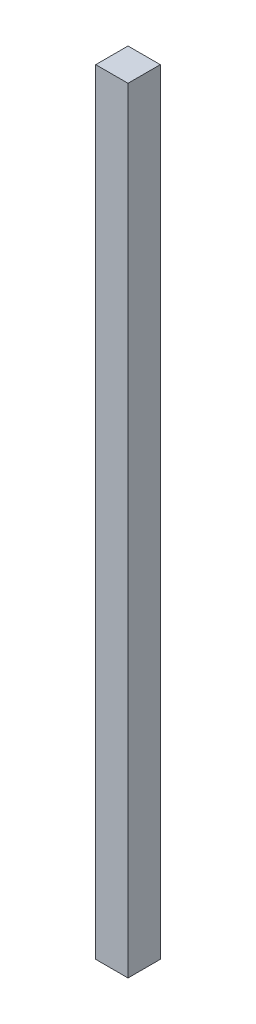
ISO-10303-21;
HEADER;
FILE_DESCRIPTION(('STEP AP214'),'2;1');
FILE_NAME('part.step','',(''),(''),'','','');
FILE_SCHEMA(('AUTOMOTIVE_DESIGN { 1 0 10303 214 1 1 1 1 }'));
ENDSEC;
DATA;
#1=APPLICATION_CONTEXT('core data for automotive mechanical design processes');
#2=APPLICATION_PROTOCOL_DEFINITION('international standard','automotive_design',2000,#1);
#3=PRODUCT_CONTEXT('',#1,'mechanical');
#4=PRODUCT('Part','Part','',(#3));
#5=PRODUCT_RELATED_PRODUCT_CATEGORY('part','',(#4));
#6=PRODUCT_DEFINITION_FORMATION('','',#4);
#7=PRODUCT_DEFINITION_CONTEXT('part definition',#1,'design');
#8=PRODUCT_DEFINITION('design','',#6,#7);
#9=PRODUCT_DEFINITION_SHAPE('','',#8);
#10=(LENGTH_UNIT() NAMED_UNIT(*) SI_UNIT(.MILLI.,.METRE.));
#11=(NAMED_UNIT(*) PLANE_ANGLE_UNIT() SI_UNIT($,.RADIAN.));
#12=(NAMED_UNIT(*) SI_UNIT($,.STERADIAN.) SOLID_ANGLE_UNIT());
#13=UNCERTAINTY_MEASURE_WITH_UNIT(LENGTH_MEASURE(1.E-05),#10,'distance_accuracy_value','');
#14=(GEOMETRIC_REPRESENTATION_CONTEXT(3) GLOBAL_UNCERTAINTY_ASSIGNED_CONTEXT((#13)) GLOBAL_UNIT_ASSIGNED_CONTEXT((#10,
#11,#12)) REPRESENTATION_CONTEXT('',''));
#15=CARTESIAN_POINT('',(0.,0.,0.));
#16=DIRECTION('',(0.,0.,1.));
#17=DIRECTION('',(1.,0.,0.));
#18=AXIS2_PLACEMENT_3D('',#15,#16,#17);
#19=CARTESIAN_POINT('',(50.8,2438.4,50.8));
#20=DIRECTION('',(-1.,0.,0.));
#21=DIRECTION('',(0.,0.,1.));
#22=AXIS2_PLACEMENT_3D('',#19,#20,#21);
#23=PLANE('',#22);
#24=DIRECTION('',(0.,0.,-1.));
#25=VECTOR('',#24,1.);
#26=CARTESIAN_POINT('',(50.8,0.,50.8));
#27=LINE('',#26,#25);
#28=CARTESIAN_POINT('',(50.8,0.,50.8));
#29=VERTEX_POINT('',#28);
#30=CARTESIAN_POINT('',(50.8,0.,-50.8));
#31=VERTEX_POINT('',#30);
#32=EDGE_CURVE('E111',#29,#31,#27,.T.);
#33=ORIENTED_EDGE('',*,*,#32,.T.);
#34=DIRECTION('',(0.,-1.,0.));
#35=VECTOR('',#34,1.);
#36=CARTESIAN_POINT('',(50.8,2438.4,-50.8));
#37=LINE('',#36,#35);
#38=CARTESIAN_POINT('',(50.8,2438.4,-50.8));
#39=VERTEX_POINT('',#38);
#40=EDGE_CURVE('E11',#39,#31,#37,.T.);
#41=ORIENTED_EDGE('',*,*,#40,.F.);
#42=DIRECTION('',(0.,0.,-1.));
#43=VECTOR('',#42,1.);
#44=CARTESIAN_POINT('',(50.8,2438.4,50.8));
#45=LINE('',#44,#43);
#46=CARTESIAN_POINT('',(50.8,2438.4,50.8));
#47=VERTEX_POINT('',#46);
#48=EDGE_CURVE('E95',#47,#39,#45,.T.);
#49=ORIENTED_EDGE('',*,*,#48,.F.);
#50=DIRECTION('',(0.,-1.,0.));
#51=VECTOR('',#50,1.);
#52=CARTESIAN_POINT('',(50.8,2438.4,50.8));
#53=LINE('',#52,#51);
#54=EDGE_CURVE('E107',#47,#29,#53,.T.);
#55=ORIENTED_EDGE('',*,*,#54,.T.);
#56=EDGE_LOOP('',(#33,#41,#49,#55));
#57=FACE_BOUND('',#56,.T.);
#58=ADVANCED_FACE('F43',(#57),#23,.F.);
#59=CARTESIAN_POINT('',(-50.8,2438.4,-50.8));
#60=DIRECTION('',(0.,0.,1.));
#61=DIRECTION('',(1.,0.,0.));
#62=AXIS2_PLACEMENT_3D('',#59,#60,#61);
#63=PLANE('',#62);
#64=DIRECTION('',(-1.,0.,0.));
#65=VECTOR('',#64,1.);
#66=CARTESIAN_POINT('',(-50.8,0.,-50.8));
#67=LINE('',#66,#65);
#68=CARTESIAN_POINT('',(-50.8,0.,-50.8));
#69=VERTEX_POINT('',#68);
#70=EDGE_CURVE('E100',#31,#69,#67,.T.);
#71=ORIENTED_EDGE('',*,*,#70,.T.);
#72=DIRECTION('',(0.,-1.,0.));
#73=VECTOR('',#72,1.);
#74=CARTESIAN_POINT('',(-50.8,2438.4,-50.8));
#75=LINE('',#74,#73);
#76=CARTESIAN_POINT('',(-50.8,2438.4,-50.8));
#77=VERTEX_POINT('',#76);
#78=EDGE_CURVE('E52',#77,#69,#75,.T.);
#79=ORIENTED_EDGE('',*,*,#78,.F.);
#80=DIRECTION('',(-1.,0.,0.));
#81=VECTOR('',#80,1.);
#82=CARTESIAN_POINT('',(-50.8,2438.4,-50.8));
#83=LINE('',#82,#81);
#84=EDGE_CURVE('E90',#39,#77,#83,.T.);
#85=ORIENTED_EDGE('',*,*,#84,.F.);
#86=ORIENTED_EDGE('',*,*,#40,.T.);
#87=EDGE_LOOP('',(#71,#79,#85,#86));
#88=FACE_BOUND('',#87,.T.);
#89=ADVANCED_FACE('F99',(#88),#63,.F.);
#90=CARTESIAN_POINT('',(-50.8,2438.4,50.8));
#91=DIRECTION('',(1.,0.,0.));
#92=DIRECTION('',(0.,0.,-1.));
#93=AXIS2_PLACEMENT_3D('',#90,#91,#92);
#94=PLANE('',#93);
#95=DIRECTION('',(0.,0.,1.));
#96=VECTOR('',#95,1.);
#97=CARTESIAN_POINT('',(-50.8,0.,50.8));
#98=LINE('',#97,#96);
#99=CARTESIAN_POINT('',(-50.8,0.,50.8));
#100=VERTEX_POINT('',#99);
#101=EDGE_CURVE('E77',#69,#100,#98,.T.);
#102=ORIENTED_EDGE('',*,*,#101,.T.);
#103=DIRECTION('',(0.,-1.,0.));
#104=VECTOR('',#103,1.);
#105=CARTESIAN_POINT('',(-50.8,2438.4,50.8));
#106=LINE('',#105,#104);
#107=CARTESIAN_POINT('',(-50.8,2438.4,50.8));
#108=VERTEX_POINT('',#107);
#109=EDGE_CURVE('E102',#108,#100,#106,.T.);
#110=ORIENTED_EDGE('',*,*,#109,.F.);
#111=DIRECTION('',(0.,0.,1.));
#112=VECTOR('',#111,1.);
#113=CARTESIAN_POINT('',(-50.8,2438.4,50.8));
#114=LINE('',#113,#112);
#115=EDGE_CURVE('E93',#77,#108,#114,.T.);
#116=ORIENTED_EDGE('',*,*,#115,.F.);
#117=ORIENTED_EDGE('',*,*,#78,.T.);
#118=EDGE_LOOP('',(#102,#110,#116,#117));
#119=FACE_BOUND('',#118,.T.);
#120=ADVANCED_FACE('F103',(#119),#94,.F.);
#121=CARTESIAN_POINT('',(-50.8,2438.4,50.8));
#122=DIRECTION('',(0.,0.,-1.));
#123=DIRECTION('',(-1.,0.,0.));
#124=AXIS2_PLACEMENT_3D('',#121,#122,#123);
#125=PLANE('',#124);
#126=DIRECTION('',(1.,0.,0.));
#127=VECTOR('',#126,1.);
#128=CARTESIAN_POINT('',(-50.8,0.,50.8));
#129=LINE('',#128,#127);
#130=EDGE_CURVE('E83',#100,#29,#129,.T.);
#131=ORIENTED_EDGE('',*,*,#130,.T.);
#132=ORIENTED_EDGE('',*,*,#54,.F.);
#133=DIRECTION('',(1.,0.,0.));
#134=VECTOR('',#133,1.);
#135=CARTESIAN_POINT('',(-50.8,2438.4,50.8));
#136=LINE('',#135,#134);
#137=EDGE_CURVE('E60',#108,#47,#136,.T.);
#138=ORIENTED_EDGE('',*,*,#137,.F.);
#139=ORIENTED_EDGE('',*,*,#109,.T.);
#140=EDGE_LOOP('',(#131,#132,#138,#139));
#141=FACE_BOUND('',#140,.T.);
#142=ADVANCED_FACE('F124',(#141),#125,.F.);
#143=CARTESIAN_POINT('',(0.,2438.4,0.));
#144=DIRECTION('',(0.,-1.,0.));
#145=DIRECTION('',(0.,0.,-1.));
#146=AXIS2_PLACEMENT_3D('',#143,#144,#145);
#147=PLANE('',#146);
#148=ORIENTED_EDGE('',*,*,#48,.T.);
#149=ORIENTED_EDGE('',*,*,#84,.T.);
#150=ORIENTED_EDGE('',*,*,#115,.T.);
#151=ORIENTED_EDGE('',*,*,#137,.T.);
#152=EDGE_LOOP('',(#148,#149,#150,#151));
#153=FACE_BOUND('',#152,.T.);
#154=ADVANCED_FACE('F91',(#153),#147,.F.);
#155=CARTESIAN_POINT('',(0.,0.,0.));
#156=DIRECTION('',(0.,-1.,0.));
#157=DIRECTION('',(0.,0.,-1.));
#158=AXIS2_PLACEMENT_3D('',#155,#156,#157);
#159=PLANE('',#158);
#160=ORIENTED_EDGE('',*,*,#32,.F.);
#161=ORIENTED_EDGE('',*,*,#130,.F.);
#162=ORIENTED_EDGE('',*,*,#101,.F.);
#163=ORIENTED_EDGE('',*,*,#70,.F.);
#164=EDGE_LOOP('',(#160,#161,#162,#163));
#165=FACE_BOUND('',#164,.T.);
#166=ADVANCED_FACE('F127',(#165),#159,.T.);
#167=CLOSED_SHELL('',(#58,#89,#120,#142,#154,#166));
#168=MANIFOLD_SOLID_BREP('B2',#167);
#169=ADVANCED_BREP_SHAPE_REPRESENTATION('',(#18,#168),#14);
#170=SHAPE_DEFINITION_REPRESENTATION(#9,#169);
ENDSEC;
END-ISO-10303-21;
